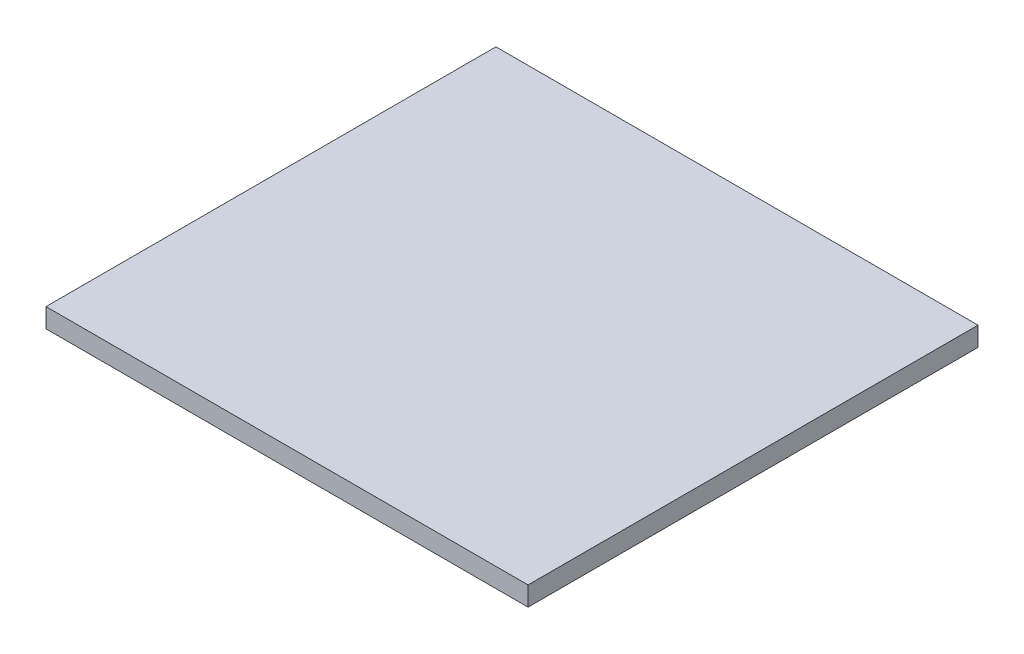
ISO-10303-21;
HEADER;
FILE_DESCRIPTION(('STEP AP214'),'2;1');
FILE_NAME('part.step','',(''),(''),'','','');
FILE_SCHEMA(('AUTOMOTIVE_DESIGN { 1 0 10303 214 1 1 1 1 }'));
ENDSEC;
DATA;
#1=APPLICATION_CONTEXT('core data for automotive mechanical design processes');
#2=APPLICATION_PROTOCOL_DEFINITION('international standard','automotive_design',2000,#1);
#3=PRODUCT_CONTEXT('',#1,'mechanical');
#4=PRODUCT('Part','Part','',(#3));
#5=PRODUCT_RELATED_PRODUCT_CATEGORY('part','',(#4));
#6=PRODUCT_DEFINITION_FORMATION('','',#4);
#7=PRODUCT_DEFINITION_CONTEXT('part definition',#1,'design');
#8=PRODUCT_DEFINITION('design','',#6,#7);
#9=PRODUCT_DEFINITION_SHAPE('','',#8);
#10=(LENGTH_UNIT() NAMED_UNIT(*) SI_UNIT(.MILLI.,.METRE.));
#11=(NAMED_UNIT(*) PLANE_ANGLE_UNIT() SI_UNIT($,.RADIAN.));
#12=(NAMED_UNIT(*) SI_UNIT($,.STERADIAN.) SOLID_ANGLE_UNIT());
#13=UNCERTAINTY_MEASURE_WITH_UNIT(LENGTH_MEASURE(1.E-05),#10,'distance_accuracy_value','');
#14=(GEOMETRIC_REPRESENTATION_CONTEXT(3) GLOBAL_UNCERTAINTY_ASSIGNED_CONTEXT((#13)) GLOBAL_UNIT_ASSIGNED_CONTEXT((#10,
#11,#12)) REPRESENTATION_CONTEXT('',''));
#15=CARTESIAN_POINT('',(0.,0.,0.));
#16=DIRECTION('',(0.,0.,1.));
#17=DIRECTION('',(1.,0.,0.));
#18=AXIS2_PLACEMENT_3D('',#15,#16,#17);
#19=CARTESIAN_POINT('',(75.,6.,-70.));
#20=DIRECTION('',(-1.,0.,0.));
#21=DIRECTION('',(0.,0.,1.));
#22=AXIS2_PLACEMENT_3D('',#19,#20,#21);
#23=PLANE('',#22);
#24=DIRECTION('',(0.,0.,-1.));
#25=VECTOR('',#24,1.);
#26=CARTESIAN_POINT('',(75.,0.,-70.));
#27=LINE('',#26,#25);
#28=CARTESIAN_POINT('',(75.,0.,70.));
#29=VERTEX_POINT('',#28);
#30=CARTESIAN_POINT('',(75.,0.,-70.));
#31=VERTEX_POINT('',#30);
#32=EDGE_CURVE('E107',#29,#31,#27,.T.);
#33=ORIENTED_EDGE('',*,*,#32,.T.);
#34=DIRECTION('',(0.,-1.,0.));
#35=VECTOR('',#34,1.);
#36=CARTESIAN_POINT('',(75.,6.,-70.));
#37=LINE('',#36,#35);
#38=CARTESIAN_POINT('',(75.,6.,-70.));
#39=VERTEX_POINT('',#38);
#40=EDGE_CURVE('E11',#39,#31,#37,.T.);
#41=ORIENTED_EDGE('',*,*,#40,.F.);
#42=DIRECTION('',(0.,0.,-1.));
#43=VECTOR('',#42,1.);
#44=CARTESIAN_POINT('',(75.,6.,-70.));
#45=LINE('',#44,#43);
#46=CARTESIAN_POINT('',(75.,6.,70.));
#47=VERTEX_POINT('',#46);
#48=EDGE_CURVE('E91',#47,#39,#45,.T.);
#49=ORIENTED_EDGE('',*,*,#48,.F.);
#50=DIRECTION('',(0.,-1.,0.));
#51=VECTOR('',#50,1.);
#52=CARTESIAN_POINT('',(75.,6.,70.));
#53=LINE('',#52,#51);
#54=EDGE_CURVE('E103',#47,#29,#53,.T.);
#55=ORIENTED_EDGE('',*,*,#54,.T.);
#56=EDGE_LOOP('',(#33,#41,#49,#55));
#57=FACE_BOUND('',#56,.T.);
#58=ADVANCED_FACE('F39',(#57),#23,.F.);
#59=CARTESIAN_POINT('',(-75.,6.,-70.));
#60=DIRECTION('',(0.,0.,1.));
#61=DIRECTION('',(1.,0.,0.));
#62=AXIS2_PLACEMENT_3D('',#59,#60,#61);
#63=PLANE('',#62);
#64=DIRECTION('',(-1.,0.,0.));
#65=VECTOR('',#64,1.);
#66=CARTESIAN_POINT('',(-75.,0.,-70.));
#67=LINE('',#66,#65);
#68=CARTESIAN_POINT('',(-75.,0.,-70.));
#69=VERTEX_POINT('',#68);
#70=EDGE_CURVE('E96',#31,#69,#67,.T.);
#71=ORIENTED_EDGE('',*,*,#70,.T.);
#72=DIRECTION('',(0.,-1.,0.));
#73=VECTOR('',#72,1.);
#74=CARTESIAN_POINT('',(-75.,6.,-70.));
#75=LINE('',#74,#73);
#76=CARTESIAN_POINT('',(-75.,6.,-70.));
#77=VERTEX_POINT('',#76);
#78=EDGE_CURVE('E48',#77,#69,#75,.T.);
#79=ORIENTED_EDGE('',*,*,#78,.F.);
#80=DIRECTION('',(-1.,0.,0.));
#81=VECTOR('',#80,1.);
#82=CARTESIAN_POINT('',(-75.,6.,-70.));
#83=LINE('',#82,#81);
#84=EDGE_CURVE('E86',#39,#77,#83,.T.);
#85=ORIENTED_EDGE('',*,*,#84,.F.);
#86=ORIENTED_EDGE('',*,*,#40,.T.);
#87=EDGE_LOOP('',(#71,#79,#85,#86));
#88=FACE_BOUND('',#87,.T.);
#89=ADVANCED_FACE('F95',(#88),#63,.F.);
#90=CARTESIAN_POINT('',(-75.,6.,-70.));
#91=DIRECTION('',(1.,0.,0.));
#92=DIRECTION('',(0.,0.,-1.));
#93=AXIS2_PLACEMENT_3D('',#90,#91,#92);
#94=PLANE('',#93);
#95=DIRECTION('',(0.,0.,1.));
#96=VECTOR('',#95,1.);
#97=CARTESIAN_POINT('',(-75.,0.,-70.));
#98=LINE('',#97,#96);
#99=CARTESIAN_POINT('',(-75.,0.,70.));
#100=VERTEX_POINT('',#99);
#101=EDGE_CURVE('E73',#69,#100,#98,.T.);
#102=ORIENTED_EDGE('',*,*,#101,.T.);
#103=DIRECTION('',(0.,-1.,0.));
#104=VECTOR('',#103,1.);
#105=CARTESIAN_POINT('',(-75.,6.,70.));
#106=LINE('',#105,#104);
#107=CARTESIAN_POINT('',(-75.,6.,70.));
#108=VERTEX_POINT('',#107);
#109=EDGE_CURVE('E98',#108,#100,#106,.T.);
#110=ORIENTED_EDGE('',*,*,#109,.F.);
#111=DIRECTION('',(0.,0.,1.));
#112=VECTOR('',#111,1.);
#113=CARTESIAN_POINT('',(-75.,6.,-70.));
#114=LINE('',#113,#112);
#115=EDGE_CURVE('E89',#77,#108,#114,.T.);
#116=ORIENTED_EDGE('',*,*,#115,.F.);
#117=ORIENTED_EDGE('',*,*,#78,.T.);
#118=EDGE_LOOP('',(#102,#110,#116,#117));
#119=FACE_BOUND('',#118,.T.);
#120=ADVANCED_FACE('F99',(#119),#94,.F.);
#121=CARTESIAN_POINT('',(-75.,6.,70.));
#122=DIRECTION('',(0.,0.,-1.));
#123=DIRECTION('',(-1.,0.,0.));
#124=AXIS2_PLACEMENT_3D('',#121,#122,#123);
#125=PLANE('',#124);
#126=DIRECTION('',(1.,0.,0.));
#127=VECTOR('',#126,1.);
#128=CARTESIAN_POINT('',(-75.,0.,70.));
#129=LINE('',#128,#127);
#130=EDGE_CURVE('E79',#100,#29,#129,.T.);
#131=ORIENTED_EDGE('',*,*,#130,.T.);
#132=ORIENTED_EDGE('',*,*,#54,.F.);
#133=DIRECTION('',(1.,0.,0.));
#134=VECTOR('',#133,1.);
#135=CARTESIAN_POINT('',(-75.,6.,70.));
#136=LINE('',#135,#134);
#137=EDGE_CURVE('E56',#108,#47,#136,.T.);
#138=ORIENTED_EDGE('',*,*,#137,.F.);
#139=ORIENTED_EDGE('',*,*,#109,.T.);
#140=EDGE_LOOP('',(#131,#132,#138,#139));
#141=FACE_BOUND('',#140,.T.);
#142=ADVANCED_FACE('F120',(#141),#125,.F.);
#143=CARTESIAN_POINT('',(0.,6.,0.));
#144=DIRECTION('',(0.,1.,0.));
#145=DIRECTION('',(0.,0.,1.));
#146=AXIS2_PLACEMENT_3D('',#143,#144,#145);
#147=PLANE('',#146);
#148=ORIENTED_EDGE('',*,*,#48,.T.);
#149=ORIENTED_EDGE('',*,*,#84,.T.);
#150=ORIENTED_EDGE('',*,*,#115,.T.);
#151=ORIENTED_EDGE('',*,*,#137,.T.);
#152=EDGE_LOOP('',(#148,#149,#150,#151));
#153=FACE_BOUND('',#152,.T.);
#154=ADVANCED_FACE('F87',(#153),#147,.T.);
#155=CARTESIAN_POINT('',(0.,0.,0.));
#156=DIRECTION('',(0.,1.,0.));
#157=DIRECTION('',(0.,0.,1.));
#158=AXIS2_PLACEMENT_3D('',#155,#156,#157);
#159=PLANE('',#158);
#160=ORIENTED_EDGE('',*,*,#32,.F.);
#161=ORIENTED_EDGE('',*,*,#130,.F.);
#162=ORIENTED_EDGE('',*,*,#101,.F.);
#163=ORIENTED_EDGE('',*,*,#70,.F.);
#164=EDGE_LOOP('',(#160,#161,#162,#163));
#165=FACE_BOUND('',#164,.T.);
#166=ADVANCED_FACE('F123',(#165),#159,.F.);
#167=CLOSED_SHELL('',(#58,#89,#120,#142,#154,#166));
#168=MANIFOLD_SOLID_BREP('B2',#167);
#169=ADVANCED_BREP_SHAPE_REPRESENTATION('',(#18,#168),#14);
#170=SHAPE_DEFINITION_REPRESENTATION(#9,#169);
ENDSEC;
END-ISO-10303-21;
